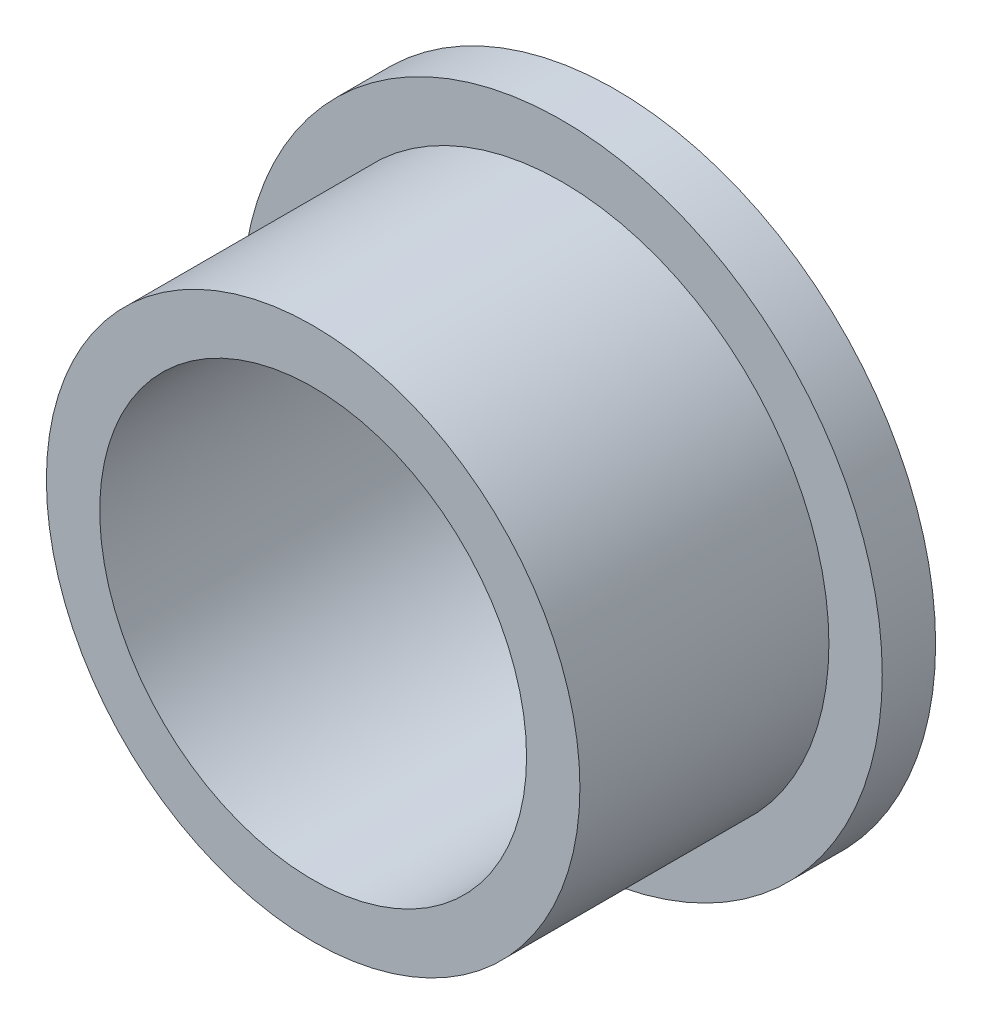
ISO-10303-21;
HEADER;
FILE_DESCRIPTION(('STEP AP214'),'2;1');
FILE_NAME('part.step','',(''),(''),'','','');
FILE_SCHEMA(('AUTOMOTIVE_DESIGN { 1 0 10303 214 1 1 1 1 }'));
ENDSEC;
DATA;
#1=APPLICATION_CONTEXT('core data for automotive mechanical design processes');
#2=APPLICATION_PROTOCOL_DEFINITION('international standard','automotive_design',2000,#1);
#3=PRODUCT_CONTEXT('',#1,'mechanical');
#4=PRODUCT('Part','Part','',(#3));
#5=PRODUCT_RELATED_PRODUCT_CATEGORY('part','',(#4));
#6=PRODUCT_DEFINITION_FORMATION('','',#4);
#7=PRODUCT_DEFINITION_CONTEXT('part definition',#1,'design');
#8=PRODUCT_DEFINITION('design','',#6,#7);
#9=PRODUCT_DEFINITION_SHAPE('','',#8);
#10=(LENGTH_UNIT() NAMED_UNIT(*) SI_UNIT(.MILLI.,.METRE.));
#11=(NAMED_UNIT(*) PLANE_ANGLE_UNIT() SI_UNIT($,.RADIAN.));
#12=(NAMED_UNIT(*) SI_UNIT($,.STERADIAN.) SOLID_ANGLE_UNIT());
#13=UNCERTAINTY_MEASURE_WITH_UNIT(LENGTH_MEASURE(1.E-05),#10,'distance_accuracy_value','');
#14=(GEOMETRIC_REPRESENTATION_CONTEXT(3) GLOBAL_UNCERTAINTY_ASSIGNED_CONTEXT((#13)) GLOBAL_UNIT_ASSIGNED_CONTEXT((#10,
#11,#12)) REPRESENTATION_CONTEXT('',''));
#15=CARTESIAN_POINT('',(0.,0.,0.));
#16=DIRECTION('',(0.,0.,1.));
#17=DIRECTION('',(1.,0.,0.));
#18=AXIS2_PLACEMENT_3D('',#15,#16,#17);
#19=CARTESIAN_POINT('',(15.,0.,0.));
#20=DIRECTION('',(0.,0.,1.));
#21=DIRECTION('',(1.,0.,0.));
#22=AXIS2_PLACEMENT_3D('',#19,#20,#21);
#23=PLANE('',#22);
#24=CARTESIAN_POINT('',(0.,0.,0.));
#25=DIRECTION('',(0.,0.,1.));
#26=DIRECTION('',(1.,0.,0.));
#27=AXIS2_PLACEMENT_3D('',#24,#25,#26);
#28=CIRCLE('',#27,15.);
#29=CARTESIAN_POINT('',(15.,0.,0.));
#30=VERTEX_POINT('',#29);
#31=EDGE_CURVE('E54',#30,#30,#28,.T.);
#32=ORIENTED_EDGE('',*,*,#31,.T.);
#33=EDGE_LOOP('',(#32));
#34=FACE_BOUND('',#33,.T.);
#35=CARTESIAN_POINT('',(0.,0.,0.));
#36=DIRECTION('',(0.,0.,1.));
#37=DIRECTION('',(1.,0.,0.));
#38=AXIS2_PLACEMENT_3D('',#35,#36,#37);
#39=CIRCLE('',#38,12.);
#40=CARTESIAN_POINT('',(12.,0.,0.));
#41=VERTEX_POINT('',#40);
#42=EDGE_CURVE('E10',#41,#41,#39,.T.);
#43=ORIENTED_EDGE('',*,*,#42,.F.);
#44=EDGE_LOOP('',(#43));
#45=FACE_BOUND('',#44,.T.);
#46=ADVANCED_FACE('F32',(#34,#45),#23,.T.);
#47=CARTESIAN_POINT('',(0.,0.,0.));
#48=DIRECTION('',(0.,0.,1.));
#49=DIRECTION('',(1.,0.,0.));
#50=AXIS2_PLACEMENT_3D('',#47,#48,#49);
#51=CYLINDRICAL_SURFACE('',#50,12.);
#52=ORIENTED_EDGE('',*,*,#42,.T.);
#53=EDGE_LOOP('',(#52));
#54=FACE_BOUND('',#53,.T.);
#55=CARTESIAN_POINT('',(0.,0.,-17.));
#56=DIRECTION('',(0.,0.,1.));
#57=DIRECTION('',(1.,0.,0.));
#58=AXIS2_PLACEMENT_3D('',#55,#56,#57);
#59=CIRCLE('',#58,12.);
#60=CARTESIAN_POINT('',(12.,0.,-17.));
#61=VERTEX_POINT('',#60);
#62=EDGE_CURVE('E38',#61,#61,#59,.T.);
#63=ORIENTED_EDGE('',*,*,#62,.F.);
#64=EDGE_LOOP('',(#63));
#65=FACE_BOUND('',#64,.T.);
#66=ADVANCED_FACE('F72',(#54,#65),#51,.F.);
#67=CARTESIAN_POINT('',(12.,0.,-17.));
#68=DIRECTION('',(0.,0.,-1.));
#69=DIRECTION('',(-1.,0.,0.));
#70=AXIS2_PLACEMENT_3D('',#67,#68,#69);
#71=PLANE('',#70);
#72=ORIENTED_EDGE('',*,*,#62,.T.);
#73=EDGE_LOOP('',(#72));
#74=FACE_BOUND('',#73,.T.);
#75=CARTESIAN_POINT('',(0.,0.,-17.));
#76=DIRECTION('',(0.,0.,1.));
#77=DIRECTION('',(1.,0.,0.));
#78=AXIS2_PLACEMENT_3D('',#75,#76,#77);
#79=CIRCLE('',#78,18.);
#80=CARTESIAN_POINT('',(18.,0.,-17.));
#81=VERTEX_POINT('',#80);
#82=EDGE_CURVE('E42',#81,#81,#79,.T.);
#83=ORIENTED_EDGE('',*,*,#82,.F.);
#84=EDGE_LOOP('',(#83));
#85=FACE_BOUND('',#84,.T.);
#86=ADVANCED_FACE('F76',(#74,#85),#71,.T.);
#87=CARTESIAN_POINT('',(0.,0.,0.));
#88=DIRECTION('',(0.,0.,1.));
#89=DIRECTION('',(1.,0.,0.));
#90=AXIS2_PLACEMENT_3D('',#87,#88,#89);
#91=CYLINDRICAL_SURFACE('',#90,18.);
#92=ORIENTED_EDGE('',*,*,#82,.T.);
#93=EDGE_LOOP('',(#92));
#94=FACE_BOUND('',#93,.T.);
#95=CARTESIAN_POINT('',(0.,0.,-14.));
#96=DIRECTION('',(0.,0.,1.));
#97=DIRECTION('',(1.,0.,0.));
#98=AXIS2_PLACEMENT_3D('',#95,#96,#97);
#99=CIRCLE('',#98,18.);
#100=CARTESIAN_POINT('',(18.,0.,-14.));
#101=VERTEX_POINT('',#100);
#102=EDGE_CURVE('E46',#101,#101,#99,.T.);
#103=ORIENTED_EDGE('',*,*,#102,.F.);
#104=EDGE_LOOP('',(#103));
#105=FACE_BOUND('',#104,.T.);
#106=ADVANCED_FACE('F68',(#94,#105),#91,.T.);
#107=CARTESIAN_POINT('',(18.,0.,-14.));
#108=DIRECTION('',(0.,0.,1.));
#109=DIRECTION('',(1.,0.,0.));
#110=AXIS2_PLACEMENT_3D('',#107,#108,#109);
#111=PLANE('',#110);
#112=ORIENTED_EDGE('',*,*,#102,.T.);
#113=EDGE_LOOP('',(#112));
#114=FACE_BOUND('',#113,.T.);
#115=CARTESIAN_POINT('',(0.,0.,-14.));
#116=DIRECTION('',(0.,0.,1.));
#117=DIRECTION('',(1.,0.,0.));
#118=AXIS2_PLACEMENT_3D('',#115,#116,#117);
#119=CIRCLE('',#118,15.);
#120=CARTESIAN_POINT('',(15.,0.,-14.));
#121=VERTEX_POINT('',#120);
#122=EDGE_CURVE('E51',#121,#121,#119,.T.);
#123=ORIENTED_EDGE('',*,*,#122,.F.);
#124=EDGE_LOOP('',(#123));
#125=FACE_BOUND('',#124,.T.);
#126=ADVANCED_FACE('F62',(#114,#125),#111,.T.);
#127=CARTESIAN_POINT('',(0.,0.,0.));
#128=DIRECTION('',(0.,0.,1.));
#129=DIRECTION('',(1.,0.,0.));
#130=AXIS2_PLACEMENT_3D('',#127,#128,#129);
#131=CYLINDRICAL_SURFACE('',#130,15.);
#132=ORIENTED_EDGE('',*,*,#122,.T.);
#133=EDGE_LOOP('',(#132));
#134=FACE_BOUND('',#133,.T.);
#135=ORIENTED_EDGE('',*,*,#31,.F.);
#136=EDGE_LOOP('',(#135));
#137=FACE_BOUND('',#136,.T.);
#138=ADVANCED_FACE('F60',(#134,#137),#131,.T.);
#139=CLOSED_SHELL('',(#46,#66,#86,#106,#126,#138));
#140=MANIFOLD_SOLID_BREP('B2',#139);
#141=ADVANCED_BREP_SHAPE_REPRESENTATION('',(#18,#140),#14);
#142=SHAPE_DEFINITION_REPRESENTATION(#9,#141);
ENDSEC;
END-ISO-10303-21;
